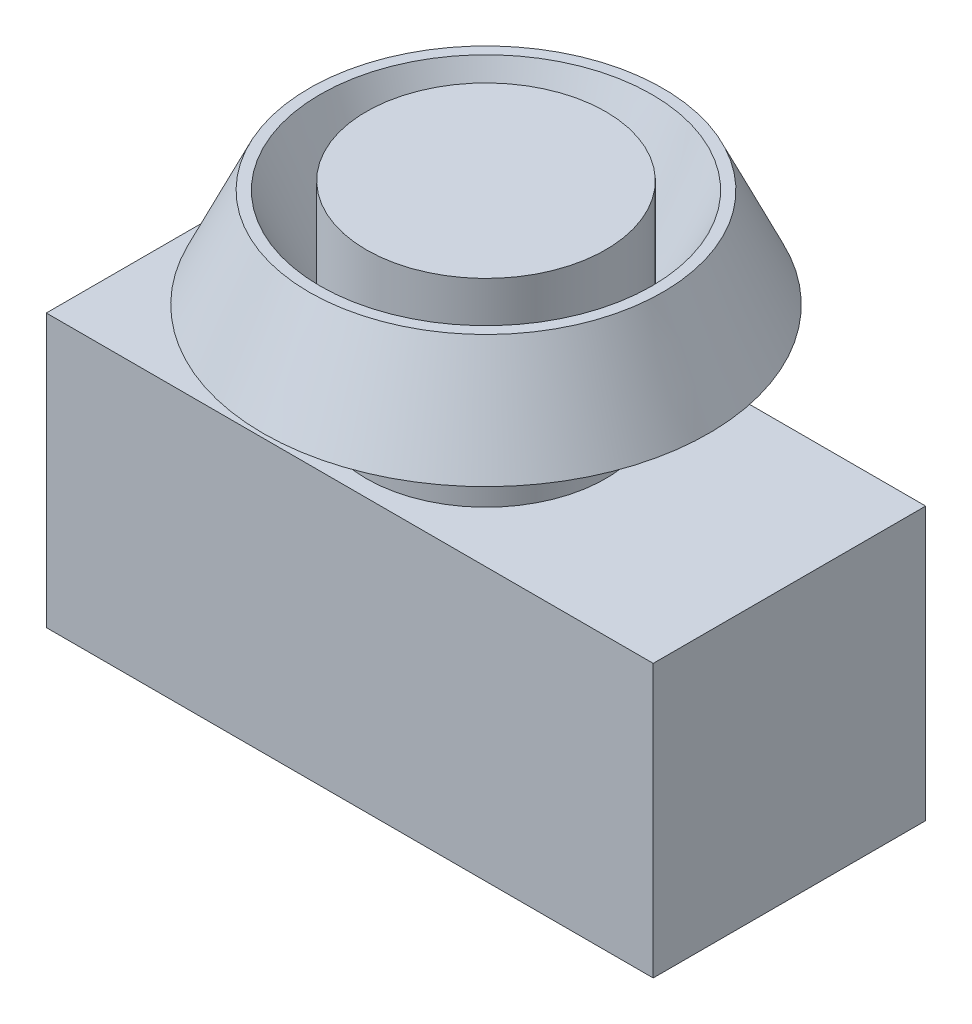
ISO-10303-21;
HEADER;
FILE_DESCRIPTION(('STEP AP214'),'2;1');
FILE_NAME('part.step','',(''),(''),'','','');
FILE_SCHEMA(('AUTOMOTIVE_DESIGN { 1 0 10303 214 1 1 1 1 }'));
ENDSEC;
DATA;
#1=APPLICATION_CONTEXT('core data for automotive mechanical design processes');
#2=APPLICATION_PROTOCOL_DEFINITION('international standard','automotive_design',2000,#1);
#3=PRODUCT_CONTEXT('',#1,'mechanical');
#4=PRODUCT('Part','Part','',(#3));
#5=PRODUCT_RELATED_PRODUCT_CATEGORY('part','',(#4));
#6=PRODUCT_DEFINITION_FORMATION('','',#4);
#7=PRODUCT_DEFINITION_CONTEXT('part definition',#1,'design');
#8=PRODUCT_DEFINITION('design','',#6,#7);
#9=PRODUCT_DEFINITION_SHAPE('','',#8);
#10=(LENGTH_UNIT() NAMED_UNIT(*) SI_UNIT(.MILLI.,.METRE.));
#11=(NAMED_UNIT(*) PLANE_ANGLE_UNIT() SI_UNIT($,.RADIAN.));
#12=(NAMED_UNIT(*) SI_UNIT($,.STERADIAN.) SOLID_ANGLE_UNIT());
#13=UNCERTAINTY_MEASURE_WITH_UNIT(LENGTH_MEASURE(1.E-05),#10,'distance_accuracy_value','');
#14=(GEOMETRIC_REPRESENTATION_CONTEXT(3) GLOBAL_UNCERTAINTY_ASSIGNED_CONTEXT((#13)) GLOBAL_UNIT_ASSIGNED_CONTEXT((#10,
#11,#12)) REPRESENTATION_CONTEXT('',''));
#15=CARTESIAN_POINT('',(0.,0.,0.));
#16=DIRECTION('',(0.,0.,1.));
#17=DIRECTION('',(1.,0.,0.));
#18=AXIS2_PLACEMENT_3D('',#15,#16,#17);
#19=CARTESIAN_POINT('',(0.,15.6765625,6.5484375));
#20=DIRECTION('',(0.,1.,0.));
#21=DIRECTION('',(0.,0.,1.));
#22=AXIS2_PLACEMENT_3D('',#19,#20,#21);
#23=PLANE('',#22);
#24=CARTESIAN_POINT('',(0.,15.6765625,6.5484375));
#25=DIRECTION('',(0.,1.,0.));
#26=DIRECTION('',(0.,0.,1.));
#27=AXIS2_PLACEMENT_3D('',#24,#25,#26);
#28=CIRCLE('',#27,8.49483477803681);
#29=CARTESIAN_POINT('',(0.,15.6765625,15.0432722780368));
#30=VERTEX_POINT('',#29);
#31=EDGE_CURVE('E11',#30,#30,#28,.T.);
#32=ORIENTED_EDGE('',*,*,#31,.T.);
#33=EDGE_LOOP('',(#32));
#34=FACE_BOUND('',#33,.T.);
#35=CARTESIAN_POINT('',(0.,15.6765625,6.5484375));
#36=DIRECTION('',(0.,1.,0.));
#37=DIRECTION('',(0.,0.,1.));
#38=AXIS2_PLACEMENT_3D('',#35,#36,#37);
#39=CIRCLE('',#38,7.97547772196318);
#40=CARTESIAN_POINT('',(0.,15.6765625,14.5239152219632));
#41=VERTEX_POINT('',#40);
#42=EDGE_CURVE('E48',#41,#41,#39,.T.);
#43=ORIENTED_EDGE('',*,*,#42,.F.);
#44=EDGE_LOOP('',(#43));
#45=FACE_BOUND('',#44,.T.);
#46=ADVANCED_FACE('F44',(#34,#45),#23,.T.);
#47=CARTESIAN_POINT('',(0.,10.9140625,6.5484375));
#48=DIRECTION('',(0.,1.,0.));
#49=DIRECTION('',(0.,0.,1.));
#50=AXIS2_PLACEMENT_3D('',#47,#48,#49);
#51=PLANE('',#50);
#52=CARTESIAN_POINT('',(0.,10.9140625,6.5484375));
#53=DIRECTION('',(0.,1.,0.));
#54=DIRECTION('',(0.,0.,1.));
#55=AXIS2_PLACEMENT_3D('',#52,#53,#54);
#56=CIRCLE('',#55,10.715625);
#57=CARTESIAN_POINT('',(0.,10.9140625,17.2640625));
#58=VERTEX_POINT('',#57);
#59=EDGE_CURVE('E52',#58,#58,#56,.T.);
#60=ORIENTED_EDGE('',*,*,#59,.F.);
#61=EDGE_LOOP('',(#60));
#62=FACE_BOUND('',#61,.T.);
#63=CARTESIAN_POINT('',(0.,10.9140625,6.5484375));
#64=DIRECTION('',(0.,1.,0.));
#65=DIRECTION('',(0.,0.,1.));
#66=AXIS2_PLACEMENT_3D('',#63,#64,#65);
#67=CIRCLE('',#66,5.7546875);
#68=CARTESIAN_POINT('',(0.,10.9140625,12.303125));
#69=VERTEX_POINT('',#68);
#70=EDGE_CURVE('E58',#69,#69,#67,.T.);
#71=ORIENTED_EDGE('',*,*,#70,.T.);
#72=EDGE_LOOP('',(#71));
#73=FACE_BOUND('',#72,.T.);
#74=ADVANCED_FACE('F68',(#62,#73),#51,.F.);
#75=CARTESIAN_POINT('',(0.,10.9140625,6.5484375));
#76=DIRECTION('',(0.,-1.,0.));
#77=DIRECTION('',(0.,0.,1.));
#78=AXIS2_PLACEMENT_3D('',#75,#76,#77);
#79=CONICAL_SURFACE('',#78,10.715625,0.436332312998583);
#80=ORIENTED_EDGE('',*,*,#31,.F.);
#81=EDGE_LOOP('',(#80));
#82=FACE_BOUND('',#81,.T.);
#83=ORIENTED_EDGE('',*,*,#59,.T.);
#84=EDGE_LOOP('',(#83));
#85=FACE_BOUND('',#84,.T.);
#86=ADVANCED_FACE('F73',(#82,#85),#79,.T.);
#87=CARTESIAN_POINT('',(0.,10.9140625,6.5484375));
#88=DIRECTION('',(0.,1.,0.));
#89=DIRECTION('',(0.,0.,1.));
#90=AXIS2_PLACEMENT_3D('',#87,#88,#89);
#91=CONICAL_SURFACE('',#90,5.7546875,0.436332312998583);
#92=ORIENTED_EDGE('',*,*,#42,.T.);
#93=EDGE_LOOP('',(#92));
#94=FACE_BOUND('',#93,.T.);
#95=ORIENTED_EDGE('',*,*,#70,.F.);
#96=EDGE_LOOP('',(#95));
#97=FACE_BOUND('',#96,.T.);
#98=ADVANCED_FACE('F46',(#94,#97),#91,.F.);
#99=CLOSED_SHELL('',(#46,#74,#86,#98));
#100=MANIFOLD_SOLID_BREP('B2',#99);
#101=CARTESIAN_POINT('',(14.58515625,6.5484375,13.096875));
#102=DIRECTION('',(-1.,0.,0.));
#103=DIRECTION('',(0.,0.,1.));
#104=AXIS2_PLACEMENT_3D('',#101,#102,#103);
#105=PLANE('',#104);
#106=DIRECTION('',(0.,1.,0.));
#107=VECTOR('',#106,1.);
#108=CARTESIAN_POINT('',(14.58515625,6.5484375,0.));
#109=LINE('',#108,#107);
#110=CARTESIAN_POINT('',(14.58515625,-6.5484375,0.));
#111=VERTEX_POINT('',#110);
#112=CARTESIAN_POINT('',(14.58515625,6.5484375,0.));
#113=VERTEX_POINT('',#112);
#114=EDGE_CURVE('E179',#111,#113,#109,.T.);
#115=ORIENTED_EDGE('',*,*,#114,.T.);
#116=DIRECTION('',(0.,0.,-1.));
#117=VECTOR('',#116,1.);
#118=CARTESIAN_POINT('',(14.58515625,6.5484375,13.096875));
#119=LINE('',#118,#117);
#120=CARTESIAN_POINT('',(14.58515625,6.5484375,13.096875));
#121=VERTEX_POINT('',#120);
#122=EDGE_CURVE('E116',#121,#113,#119,.T.);
#123=ORIENTED_EDGE('',*,*,#122,.F.);
#124=DIRECTION('',(0.,1.,0.));
#125=VECTOR('',#124,1.);
#126=CARTESIAN_POINT('',(14.58515625,6.5484375,13.096875));
#127=LINE('',#126,#125);
#128=CARTESIAN_POINT('',(14.58515625,-6.5484375,13.096875));
#129=VERTEX_POINT('',#128);
#130=EDGE_CURVE('E166',#129,#121,#127,.T.);
#131=ORIENTED_EDGE('',*,*,#130,.F.);
#132=DIRECTION('',(0.,0.,-1.));
#133=VECTOR('',#132,1.);
#134=CARTESIAN_POINT('',(14.58515625,-6.5484375,13.096875));
#135=LINE('',#134,#133);
#136=EDGE_CURVE('E175',#129,#111,#135,.T.);
#137=ORIENTED_EDGE('',*,*,#136,.T.);
#138=EDGE_LOOP('',(#115,#123,#131,#137));
#139=FACE_BOUND('',#138,.T.);
#140=ADVANCED_FACE('F113',(#139),#105,.F.);
#141=CARTESIAN_POINT('',(-14.58515625,6.5484375,13.096875));
#142=DIRECTION('',(0.,-1.,0.));
#143=DIRECTION('',(0.,0.,-1.));
#144=AXIS2_PLACEMENT_3D('',#141,#142,#143);
#145=PLANE('',#144);
#146=CARTESIAN_POINT('',(0.,6.5484375,6.5484375));
#147=DIRECTION('',(0.,1.,0.));
#148=DIRECTION('',(0.,0.,1.));
#149=AXIS2_PLACEMENT_3D('',#146,#147,#148);
#150=CIRCLE('',#149,5.7546875);
#151=CARTESIAN_POINT('',(0.,6.5484375,0.793749999999999));
#152=VERTEX_POINT('',#151);
#153=EDGE_CURVE('E42',#152,#152,#150,.T.);
#154=ORIENTED_EDGE('',*,*,#153,.F.);
#155=EDGE_LOOP('',(#154));
#156=FACE_BOUND('',#155,.T.);
#157=DIRECTION('',(-1.,0.,0.));
#158=VECTOR('',#157,1.);
#159=CARTESIAN_POINT('',(-14.58515625,6.5484375,0.));
#160=LINE('',#159,#158);
#161=CARTESIAN_POINT('',(-14.58515625,6.5484375,0.));
#162=VERTEX_POINT('',#161);
#163=EDGE_CURVE('E171',#113,#162,#160,.T.);
#164=ORIENTED_EDGE('',*,*,#163,.T.);
#165=DIRECTION('',(0.,0.,-1.));
#166=VECTOR('',#165,1.);
#167=CARTESIAN_POINT('',(-14.58515625,6.5484375,13.096875));
#168=LINE('',#167,#166);
#169=CARTESIAN_POINT('',(-14.58515625,6.5484375,13.096875));
#170=VERTEX_POINT('',#169);
#171=EDGE_CURVE('E169',#170,#162,#168,.T.);
#172=ORIENTED_EDGE('',*,*,#171,.F.);
#173=DIRECTION('',(-1.,0.,0.));
#174=VECTOR('',#173,1.);
#175=CARTESIAN_POINT('',(-14.58515625,6.5484375,13.096875));
#176=LINE('',#175,#174);
#177=EDGE_CURVE('E161',#121,#170,#176,.T.);
#178=ORIENTED_EDGE('',*,*,#177,.F.);
#179=ORIENTED_EDGE('',*,*,#122,.T.);
#180=EDGE_LOOP('',(#164,#172,#178,#179));
#181=FACE_BOUND('',#180,.T.);
#182=ADVANCED_FACE('F170',(#156,#181),#145,.F.);
#183=CARTESIAN_POINT('',(-14.58515625,6.5484375,13.096875));
#184=DIRECTION('',(1.,0.,0.));
#185=DIRECTION('',(0.,0.,-1.));
#186=AXIS2_PLACEMENT_3D('',#183,#184,#185);
#187=PLANE('',#186);
#188=DIRECTION('',(0.,-1.,0.));
#189=VECTOR('',#188,1.);
#190=CARTESIAN_POINT('',(-14.58515625,6.5484375,0.));
#191=LINE('',#190,#189);
#192=CARTESIAN_POINT('',(-14.58515625,-6.5484375,0.));
#193=VERTEX_POINT('',#192);
#194=EDGE_CURVE('E147',#162,#193,#191,.T.);
#195=ORIENTED_EDGE('',*,*,#194,.T.);
#196=DIRECTION('',(0.,0.,-1.));
#197=VECTOR('',#196,1.);
#198=CARTESIAN_POINT('',(-14.58515625,-6.5484375,13.096875));
#199=LINE('',#198,#197);
#200=CARTESIAN_POINT('',(-14.58515625,-6.5484375,13.096875));
#201=VERTEX_POINT('',#200);
#202=EDGE_CURVE('E172',#201,#193,#199,.T.);
#203=ORIENTED_EDGE('',*,*,#202,.F.);
#204=DIRECTION('',(0.,-1.,0.));
#205=VECTOR('',#204,1.);
#206=CARTESIAN_POINT('',(-14.58515625,6.5484375,13.096875));
#207=LINE('',#206,#205);
#208=EDGE_CURVE('E164',#170,#201,#207,.T.);
#209=ORIENTED_EDGE('',*,*,#208,.F.);
#210=ORIENTED_EDGE('',*,*,#171,.T.);
#211=EDGE_LOOP('',(#195,#203,#209,#210));
#212=FACE_BOUND('',#211,.T.);
#213=ADVANCED_FACE('F173',(#212),#187,.F.);
#214=CARTESIAN_POINT('',(-14.58515625,-6.5484375,13.096875));
#215=DIRECTION('',(0.,1.,0.));
#216=DIRECTION('',(0.,0.,1.));
#217=AXIS2_PLACEMENT_3D('',#214,#215,#216);
#218=PLANE('',#217);
#219=DIRECTION('',(1.,0.,0.));
#220=VECTOR('',#219,1.);
#221=CARTESIAN_POINT('',(-14.58515625,-6.5484375,0.));
#222=LINE('',#221,#220);
#223=EDGE_CURVE('E153',#193,#111,#222,.T.);
#224=ORIENTED_EDGE('',*,*,#223,.T.);
#225=ORIENTED_EDGE('',*,*,#136,.F.);
#226=DIRECTION('',(1.,0.,0.));
#227=VECTOR('',#226,1.);
#228=CARTESIAN_POINT('',(-14.58515625,-6.5484375,13.096875));
#229=LINE('',#228,#227);
#230=EDGE_CURVE('E130',#201,#129,#229,.T.);
#231=ORIENTED_EDGE('',*,*,#230,.F.);
#232=ORIENTED_EDGE('',*,*,#202,.T.);
#233=EDGE_LOOP('',(#224,#225,#231,#232));
#234=FACE_BOUND('',#233,.T.);
#235=ADVANCED_FACE('F187',(#234),#218,.F.);
#236=CARTESIAN_POINT('',(0.,0.,13.096875));
#237=DIRECTION('',(0.,0.,1.));
#238=DIRECTION('',(1.,0.,0.));
#239=AXIS2_PLACEMENT_3D('',#236,#237,#238);
#240=PLANE('',#239);
#241=ORIENTED_EDGE('',*,*,#130,.T.);
#242=ORIENTED_EDGE('',*,*,#177,.T.);
#243=ORIENTED_EDGE('',*,*,#208,.T.);
#244=ORIENTED_EDGE('',*,*,#230,.T.);
#245=EDGE_LOOP('',(#241,#242,#243,#244));
#246=FACE_BOUND('',#245,.T.);
#247=ADVANCED_FACE('F162',(#246),#240,.T.);
#248=CARTESIAN_POINT('',(0.,0.,0.));
#249=DIRECTION('',(0.,0.,1.));
#250=DIRECTION('',(1.,0.,0.));
#251=AXIS2_PLACEMENT_3D('',#248,#249,#250);
#252=PLANE('',#251);
#253=ORIENTED_EDGE('',*,*,#114,.F.);
#254=ORIENTED_EDGE('',*,*,#223,.F.);
#255=ORIENTED_EDGE('',*,*,#194,.F.);
#256=ORIENTED_EDGE('',*,*,#163,.F.);
#257=EDGE_LOOP('',(#253,#254,#255,#256));
#258=FACE_BOUND('',#257,.T.);
#259=ADVANCED_FACE('F190',(#258),#252,.F.);
#260=CARTESIAN_POINT('',(0.,16.0734375,6.5484375));
#261=DIRECTION('',(0.,-1.,0.));
#262=DIRECTION('',(0.,0.,-1.));
#263=AXIS2_PLACEMENT_3D('',#260,#261,#262);
#264=CYLINDRICAL_SURFACE('',#263,5.7546875);
#265=CARTESIAN_POINT('',(0.,16.0734375,6.5484375));
#266=DIRECTION('',(0.,1.,0.));
#267=DIRECTION('',(0.,0.,1.));
#268=AXIS2_PLACEMENT_3D('',#265,#266,#267);
#269=CIRCLE('',#268,5.7546875);
#270=CARTESIAN_POINT('',(0.,16.0734375,0.793749999999999));
#271=VERTEX_POINT('',#270);
#272=EDGE_CURVE('E182',#271,#271,#269,.T.);
#273=CARTESIAN_POINT('',(0.,16.0734375,0.793749999999999));
#274=CARTESIAN_POINT('',(0.,15.97421875,0.793749999999999));
#275=CARTESIAN_POINT('',(0.,15.875,0.793749999999999));
#276=CARTESIAN_POINT('',(0.,15.6765625,0.793749999999999));
#277=CARTESIAN_POINT('',(0.,15.57734375,0.793749999999999));
#278=CARTESIAN_POINT('',(0.,15.37890625,0.793749999999999));
#279=CARTESIAN_POINT('',(0.,15.2796875,0.793749999999999));
#280=CARTESIAN_POINT('',(0.,15.08125,0.793749999999999));
#281=CARTESIAN_POINT('',(0.,14.98203125,0.793749999999999));
#282=CARTESIAN_POINT('',(0.,14.78359375,0.793749999999999));
#283=CARTESIAN_POINT('',(0.,14.684375,0.793749999999999));
#284=CARTESIAN_POINT('',(0.,14.4859375,0.793749999999999));
#285=CARTESIAN_POINT('',(0.,14.38671875,0.793749999999999));
#286=CARTESIAN_POINT('',(0.,14.18828125,0.793749999999999));
#287=CARTESIAN_POINT('',(0.,14.0890625,0.793749999999999));
#288=CARTESIAN_POINT('',(0.,13.890625,0.793749999999999));
#289=CARTESIAN_POINT('',(0.,13.79140625,0.793749999999999));
#290=CARTESIAN_POINT('',(0.,13.59296875,0.793749999999999));
#291=CARTESIAN_POINT('',(0.,13.49375,0.793749999999999));
#292=CARTESIAN_POINT('',(0.,13.2953125,0.793749999999999));
#293=CARTESIAN_POINT('',(0.,13.19609375,0.793749999999999));
#294=CARTESIAN_POINT('',(0.,12.99765625,0.793749999999999));
#295=CARTESIAN_POINT('',(0.,12.8984375,0.793749999999999));
#296=CARTESIAN_POINT('',(0.,12.7,0.793749999999999));
#297=CARTESIAN_POINT('',(0.,12.60078125,0.793749999999999));
#298=CARTESIAN_POINT('',(0.,12.40234375,0.793749999999999));
#299=CARTESIAN_POINT('',(0.,12.303125,0.793749999999999));
#300=CARTESIAN_POINT('',(0.,12.1046875,0.793749999999999));
#301=CARTESIAN_POINT('',(0.,12.00546875,0.793749999999999));
#302=CARTESIAN_POINT('',(0.,11.80703125,0.793749999999999));
#303=CARTESIAN_POINT('',(0.,11.7078125,0.793749999999999));
#304=CARTESIAN_POINT('',(0.,11.509375,0.793749999999999));
#305=CARTESIAN_POINT('',(0.,11.41015625,0.793749999999999));
#306=CARTESIAN_POINT('',(0.,11.21171875,0.793749999999999));
#307=CARTESIAN_POINT('',(0.,11.1125,0.793749999999999));
#308=CARTESIAN_POINT('',(0.,10.9140625,0.793749999999999));
#309=CARTESIAN_POINT('',(0.,10.81484375,0.793749999999999));
#310=CARTESIAN_POINT('',(0.,10.61640625,0.793749999999999));
#311=CARTESIAN_POINT('',(0.,10.5171875,0.793749999999999));
#312=CARTESIAN_POINT('',(0.,10.31875,0.793749999999999));
#313=CARTESIAN_POINT('',(0.,10.21953125,0.793749999999999));
#314=CARTESIAN_POINT('',(0.,10.02109375,0.793749999999999));
#315=CARTESIAN_POINT('',(0.,9.921875,0.793749999999999));
#316=CARTESIAN_POINT('',(0.,9.7234375,0.793749999999999));
#317=CARTESIAN_POINT('',(0.,9.62421875,0.793749999999999));
#318=CARTESIAN_POINT('',(0.,9.42578125,0.793749999999999));
#319=CARTESIAN_POINT('',(0.,9.3265625,0.793749999999999));
#320=CARTESIAN_POINT('',(0.,9.128125,0.793749999999999));
#321=CARTESIAN_POINT('',(0.,9.02890625,0.793749999999999));
#322=CARTESIAN_POINT('',(0.,8.83046875,0.793749999999999));
#323=CARTESIAN_POINT('',(0.,8.73125,0.793749999999999));
#324=CARTESIAN_POINT('',(0.,8.5328125,0.793749999999999));
#325=CARTESIAN_POINT('',(0.,8.43359375,0.793749999999999));
#326=CARTESIAN_POINT('',(0.,8.23515625,0.793749999999999));
#327=CARTESIAN_POINT('',(0.,8.1359375,0.793749999999999));
#328=CARTESIAN_POINT('',(0.,7.9375,0.793749999999999));
#329=CARTESIAN_POINT('',(0.,7.83828125,0.793749999999999));
#330=CARTESIAN_POINT('',(0.,7.63984375,0.793749999999999));
#331=CARTESIAN_POINT('',(0.,7.540625,0.793749999999999));
#332=CARTESIAN_POINT('',(0.,7.3421875,0.793749999999999));
#333=CARTESIAN_POINT('',(0.,7.24296875,0.793749999999999));
#334=CARTESIAN_POINT('',(0.,7.04453125,0.793749999999999));
#335=CARTESIAN_POINT('',(0.,6.9453125,0.793749999999999));
#336=CARTESIAN_POINT('',(0.,6.746875,0.793749999999999));
#337=CARTESIAN_POINT('',(0.,6.64765625,0.793749999999999));
#338=CARTESIAN_POINT('',(0.,6.5484375,0.793749999999999));
#339=B_SPLINE_CURVE_WITH_KNOTS('',3,(#273,#274,#275,#276,#277,#278,#279,#280,#281,#282,#283,
#284,#285,#286,#287,#288,#289,#290,#291,#292,#293,#294,#295,#296,#297,#298,#299,#300,#301,#302,
#303,#304,#305,#306,#307,#308,#309,#310,#311,#312,#313,#314,#315,#316,#317,#318,#319,#320,#321,
#322,#323,#324,#325,#326,#327,#328,#329,#330,#331,#332,#333,#334,#335,#336,#337,#338),
.UNSPECIFIED.,.F.,.F.,(4,2,2,2,2,2,2,2,2,2,2,2,2,2,2,2,2,2,2,2,2,2,2,2,2,2,2,2,2,2,2,2,4),(0.,
0.29765625,0.595312500000002,0.892968750000002,1.190625,1.48828125,1.7859375,2.08359375,2.38125,
2.67890625,2.9765625,3.27421875,3.571875,3.86953125,4.1671875,4.46484375,4.7625,5.06015625,
5.3578125,5.65546875,5.953125,6.25078125,6.5484375,6.84609375,7.14375,7.44140625,7.7390625,
8.03671875,8.334375,8.63203125,8.9296875,9.22734375,9.525),.UNSPECIFIED.);
#340=EDGE_CURVE('BSEAM198',#271,#152,#339,.T.);
#341=ORIENTED_EDGE('',*,*,#272,.F.);
#342=ORIENTED_EDGE('',*,*,#153,.T.);
#343=ORIENTED_EDGE('',*,*,#340,.T.);
#344=ORIENTED_EDGE('',*,*,#340,.F.);
#345=EDGE_LOOP('',(#341,#343,#342,#344));
#346=FACE_BOUND('',#345,.T.);
#347=ADVANCED_FACE('F198',(#346),#264,.T.);
#348=CARTESIAN_POINT('',(0.,16.0734375,6.5484375));
#349=DIRECTION('',(0.,1.,0.));
#350=DIRECTION('',(0.,0.,1.));
#351=AXIS2_PLACEMENT_3D('',#348,#349,#350);
#352=PLANE('',#351);
#353=ORIENTED_EDGE('',*,*,#272,.T.);
#354=EDGE_LOOP('',(#353));
#355=FACE_BOUND('',#354,.T.);
#356=ADVANCED_FACE('F196',(#355),#352,.T.);
#357=CLOSED_SHELL('',(#140,#182,#213,#235,#247,#259,#347,#356));
#358=MANIFOLD_SOLID_BREP('B6',#357);
#359=ADVANCED_BREP_SHAPE_REPRESENTATION('',(#18,#100,#358),#14);
#360=SHAPE_DEFINITION_REPRESENTATION(#9,#359);
ENDSEC;
END-ISO-10303-21;
